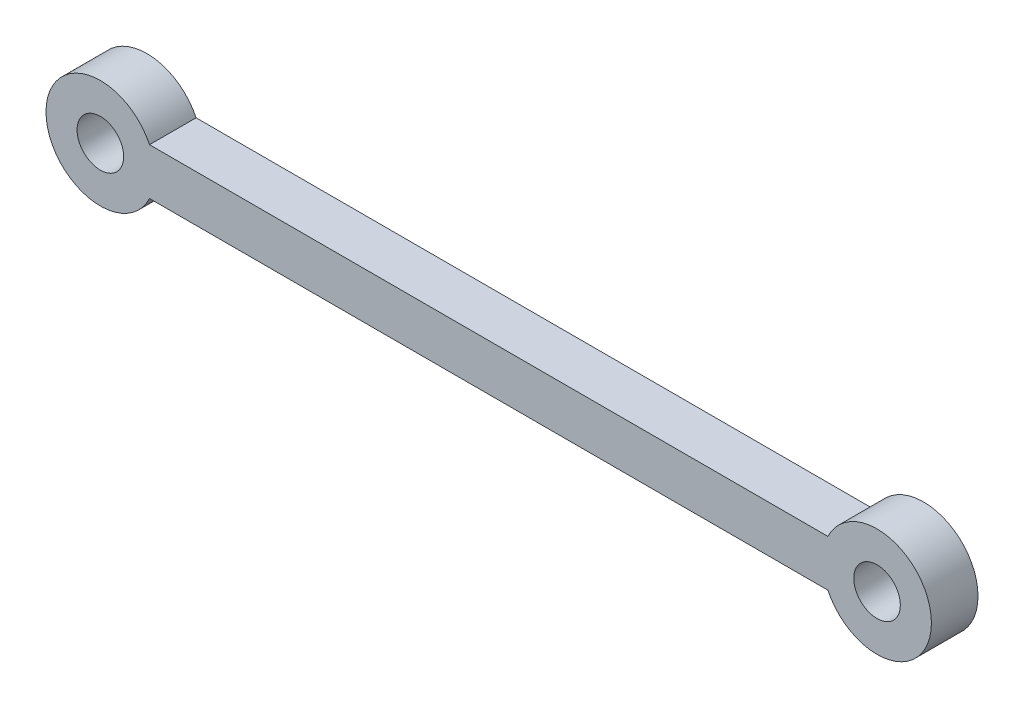
ISO-10303-21;
HEADER;
FILE_DESCRIPTION(('STEP AP214'),'2;1');
FILE_NAME('part.step','',(''),(''),'','','');
FILE_SCHEMA(('AUTOMOTIVE_DESIGN { 1 0 10303 214 1 1 1 1 }'));
ENDSEC;
DATA;
#1=APPLICATION_CONTEXT('core data for automotive mechanical design processes');
#2=APPLICATION_PROTOCOL_DEFINITION('international standard','automotive_design',2000,#1);
#3=PRODUCT_CONTEXT('',#1,'mechanical');
#4=PRODUCT('Part','Part','',(#3));
#5=PRODUCT_RELATED_PRODUCT_CATEGORY('part','',(#4));
#6=PRODUCT_DEFINITION_FORMATION('','',#4);
#7=PRODUCT_DEFINITION_CONTEXT('part definition',#1,'design');
#8=PRODUCT_DEFINITION('design','',#6,#7);
#9=PRODUCT_DEFINITION_SHAPE('','',#8);
#10=(LENGTH_UNIT() NAMED_UNIT(*) SI_UNIT(.MILLI.,.METRE.));
#11=(NAMED_UNIT(*) PLANE_ANGLE_UNIT() SI_UNIT($,.RADIAN.));
#12=(NAMED_UNIT(*) SI_UNIT($,.STERADIAN.) SOLID_ANGLE_UNIT());
#13=UNCERTAINTY_MEASURE_WITH_UNIT(LENGTH_MEASURE(1.E-05),#10,'distance_accuracy_value','');
#14=(GEOMETRIC_REPRESENTATION_CONTEXT(3) GLOBAL_UNCERTAINTY_ASSIGNED_CONTEXT((#13)) GLOBAL_UNIT_ASSIGNED_CONTEXT((#10,
#11,#12)) REPRESENTATION_CONTEXT('',''));
#15=CARTESIAN_POINT('',(0.,0.,0.));
#16=DIRECTION('',(0.,0.,1.));
#17=DIRECTION('',(1.,0.,0.));
#18=AXIS2_PLACEMENT_3D('',#15,#16,#17);
#19=CARTESIAN_POINT('',(0.,0.,3.));
#20=DIRECTION('',(0.,0.,1.));
#21=DIRECTION('',(1.,0.,0.));
#22=AXIS2_PLACEMENT_3D('',#19,#20,#21);
#23=PLANE('',#22);
#24=CARTESIAN_POINT('',(0.,0.,3.));
#25=DIRECTION('',(0.,0.,1.));
#26=DIRECTION('',(1.,0.,0.));
#27=AXIS2_PLACEMENT_3D('',#24,#25,#26);
#28=CIRCLE('',#27,1.5);
#29=CARTESIAN_POINT('',(1.5,0.,3.));
#30=VERTEX_POINT('',#29);
#31=EDGE_CURVE('E102',#30,#30,#28,.T.);
#32=ORIENTED_EDGE('',*,*,#31,.F.);
#33=EDGE_LOOP('',(#32));
#34=FACE_BOUND('',#33,.T.);
#35=CARTESIAN_POINT('',(0.,0.,3.));
#36=DIRECTION('',(0.,0.,1.));
#37=DIRECTION('',(1.,0.,0.));
#38=AXIS2_PLACEMENT_3D('',#35,#36,#37);
#39=CIRCLE('',#38,3.5);
#40=CARTESIAN_POINT('',(3.16227766016838,1.5,3.));
#41=VERTEX_POINT('',#40);
#42=CARTESIAN_POINT('',(3.16227766016838,-1.5,3.));
#43=VERTEX_POINT('',#42);
#44=EDGE_CURVE('E87',#41,#43,#39,.T.);
#45=ORIENTED_EDGE('',*,*,#44,.T.);
#46=DIRECTION('',(1.,0.,0.));
#47=VECTOR('',#46,1.);
#48=CARTESIAN_POINT('',(3.16227766016838,-1.5,3.));
#49=LINE('',#48,#47);
#50=CARTESIAN_POINT('',(46.8377223398316,-1.5,3.));
#51=VERTEX_POINT('',#50);
#52=EDGE_CURVE('E82',#43,#51,#49,.T.);
#53=ORIENTED_EDGE('',*,*,#52,.T.);
#54=CARTESIAN_POINT('',(50.,0.,3.));
#55=DIRECTION('',(0.,0.,1.));
#56=DIRECTION('',(1.,0.,0.));
#57=AXIS2_PLACEMENT_3D('',#54,#55,#56);
#58=CIRCLE('',#57,3.49999999999999);
#59=CARTESIAN_POINT('',(46.8377223398316,1.5,3.));
#60=VERTEX_POINT('',#59);
#61=EDGE_CURVE('E85',#51,#60,#58,.T.);
#62=ORIENTED_EDGE('',*,*,#61,.T.);
#63=DIRECTION('',(-1.,0.,0.));
#64=VECTOR('',#63,1.);
#65=CARTESIAN_POINT('',(3.16227766016838,1.5,3.));
#66=LINE('',#65,#64);
#67=EDGE_CURVE('E52',#60,#41,#66,.T.);
#68=ORIENTED_EDGE('',*,*,#67,.T.);
#69=EDGE_LOOP('',(#45,#53,#62,#68));
#70=FACE_BOUND('',#69,.T.);
#71=CARTESIAN_POINT('',(50.,0.,3.));
#72=DIRECTION('',(0.,0.,1.));
#73=DIRECTION('',(1.,0.,0.));
#74=AXIS2_PLACEMENT_3D('',#71,#72,#73);
#75=CIRCLE('',#74,1.5);
#76=CARTESIAN_POINT('',(51.5,0.,3.));
#77=VERTEX_POINT('',#76);
#78=EDGE_CURVE('E117',#77,#77,#75,.T.);
#79=ORIENTED_EDGE('',*,*,#78,.F.);
#80=EDGE_LOOP('',(#79));
#81=FACE_BOUND('',#80,.T.);
#82=ADVANCED_FACE('F35',(#34,#70,#81),#23,.T.);
#83=CARTESIAN_POINT('',(0.,0.,0.));
#84=DIRECTION('',(0.,0.,1.));
#85=DIRECTION('',(1.,0.,0.));
#86=AXIS2_PLACEMENT_3D('',#83,#84,#85);
#87=PLANE('',#86);
#88=CARTESIAN_POINT('',(0.,0.,0.));
#89=DIRECTION('',(0.,0.,1.));
#90=DIRECTION('',(1.,0.,0.));
#91=AXIS2_PLACEMENT_3D('',#88,#89,#90);
#92=CIRCLE('',#91,3.5);
#93=CARTESIAN_POINT('',(3.16227766016838,1.5,0.));
#94=VERTEX_POINT('',#93);
#95=CARTESIAN_POINT('',(3.16227766016838,-1.5,0.));
#96=VERTEX_POINT('',#95);
#97=EDGE_CURVE('E99',#94,#96,#92,.T.);
#98=ORIENTED_EDGE('',*,*,#97,.F.);
#99=DIRECTION('',(-1.,0.,0.));
#100=VECTOR('',#99,1.);
#101=CARTESIAN_POINT('',(3.16227766016838,1.5,0.));
#102=LINE('',#101,#100);
#103=CARTESIAN_POINT('',(46.8377223398316,1.5,0.));
#104=VERTEX_POINT('',#103);
#105=EDGE_CURVE('E75',#104,#94,#102,.T.);
#106=ORIENTED_EDGE('',*,*,#105,.F.);
#107=CARTESIAN_POINT('',(50.,0.,0.));
#108=DIRECTION('',(0.,0.,1.));
#109=DIRECTION('',(1.,0.,0.));
#110=AXIS2_PLACEMENT_3D('',#107,#108,#109);
#111=CIRCLE('',#110,3.49999999999999);
#112=CARTESIAN_POINT('',(46.8377223398316,-1.5,0.));
#113=VERTEX_POINT('',#112);
#114=EDGE_CURVE('E69',#113,#104,#111,.T.);
#115=ORIENTED_EDGE('',*,*,#114,.F.);
#116=DIRECTION('',(1.,0.,0.));
#117=VECTOR('',#116,1.);
#118=CARTESIAN_POINT('',(3.16227766016838,-1.5,0.));
#119=LINE('',#118,#117);
#120=EDGE_CURVE('E91',#96,#113,#119,.T.);
#121=ORIENTED_EDGE('',*,*,#120,.F.);
#122=EDGE_LOOP('',(#98,#106,#115,#121));
#123=FACE_BOUND('',#122,.T.);
#124=CARTESIAN_POINT('',(0.,0.,0.));
#125=DIRECTION('',(0.,0.,1.));
#126=DIRECTION('',(1.,0.,0.));
#127=AXIS2_PLACEMENT_3D('',#124,#125,#126);
#128=CIRCLE('',#127,1.5);
#129=CARTESIAN_POINT('',(1.5,0.,0.));
#130=VERTEX_POINT('',#129);
#131=EDGE_CURVE('E114',#130,#130,#128,.T.);
#132=ORIENTED_EDGE('',*,*,#131,.T.);
#133=EDGE_LOOP('',(#132));
#134=FACE_BOUND('',#133,.T.);
#135=CARTESIAN_POINT('',(50.,0.,0.));
#136=DIRECTION('',(0.,0.,1.));
#137=DIRECTION('',(1.,0.,0.));
#138=AXIS2_PLACEMENT_3D('',#135,#136,#137);
#139=CIRCLE('',#138,1.5);
#140=CARTESIAN_POINT('',(51.5,0.,0.));
#141=VERTEX_POINT('',#140);
#142=EDGE_CURVE('E120',#141,#141,#139,.T.);
#143=ORIENTED_EDGE('',*,*,#142,.T.);
#144=EDGE_LOOP('',(#143));
#145=FACE_BOUND('',#144,.T.);
#146=ADVANCED_FACE('F110',(#123,#134,#145),#87,.F.);
#147=CARTESIAN_POINT('',(0.,0.,3.));
#148=DIRECTION('',(0.,0.,-1.));
#149=DIRECTION('',(-1.,0.,0.));
#150=AXIS2_PLACEMENT_3D('',#147,#148,#149);
#151=CYLINDRICAL_SURFACE('',#150,3.5);
#152=ORIENTED_EDGE('',*,*,#97,.T.);
#153=DIRECTION('',(0.,0.,-1.));
#154=VECTOR('',#153,1.);
#155=CARTESIAN_POINT('',(3.16227766016838,-1.5,3.));
#156=LINE('',#155,#154);
#157=EDGE_CURVE('E11',#43,#96,#156,.T.);
#158=ORIENTED_EDGE('',*,*,#157,.F.);
#159=ORIENTED_EDGE('',*,*,#44,.F.);
#160=DIRECTION('',(0.,0.,-1.));
#161=VECTOR('',#160,1.);
#162=CARTESIAN_POINT('',(3.16227766016838,1.5,3.));
#163=LINE('',#162,#161);
#164=EDGE_CURVE('E95',#41,#94,#163,.T.);
#165=ORIENTED_EDGE('',*,*,#164,.T.);
#166=EDGE_LOOP('',(#152,#158,#159,#165));
#167=FACE_BOUND('',#166,.T.);
#168=ADVANCED_FACE('F37',(#167),#151,.T.);
#169=CARTESIAN_POINT('',(3.16227766016838,-1.5,3.));
#170=DIRECTION('',(0.,1.,0.));
#171=DIRECTION('',(0.,0.,1.));
#172=AXIS2_PLACEMENT_3D('',#169,#170,#171);
#173=PLANE('',#172);
#174=ORIENTED_EDGE('',*,*,#120,.T.);
#175=DIRECTION('',(0.,0.,-1.));
#176=VECTOR('',#175,1.);
#177=CARTESIAN_POINT('',(46.8377223398316,-1.5,3.));
#178=LINE('',#177,#176);
#179=EDGE_CURVE('E44',#51,#113,#178,.T.);
#180=ORIENTED_EDGE('',*,*,#179,.F.);
#181=ORIENTED_EDGE('',*,*,#52,.F.);
#182=ORIENTED_EDGE('',*,*,#157,.T.);
#183=EDGE_LOOP('',(#174,#180,#181,#182));
#184=FACE_BOUND('',#183,.T.);
#185=ADVANCED_FACE('F90',(#184),#173,.F.);
#186=CARTESIAN_POINT('',(50.,0.,3.));
#187=DIRECTION('',(0.,0.,-1.));
#188=DIRECTION('',(-1.,0.,0.));
#189=AXIS2_PLACEMENT_3D('',#186,#187,#188);
#190=CYLINDRICAL_SURFACE('',#189,3.49999999999999);
#191=ORIENTED_EDGE('',*,*,#114,.T.);
#192=DIRECTION('',(0.,0.,-1.));
#193=VECTOR('',#192,1.);
#194=CARTESIAN_POINT('',(46.8377223398316,1.5,3.));
#195=LINE('',#194,#193);
#196=EDGE_CURVE('E92',#60,#104,#195,.T.);
#197=ORIENTED_EDGE('',*,*,#196,.F.);
#198=ORIENTED_EDGE('',*,*,#61,.F.);
#199=ORIENTED_EDGE('',*,*,#179,.T.);
#200=EDGE_LOOP('',(#191,#197,#198,#199));
#201=FACE_BOUND('',#200,.T.);
#202=ADVANCED_FACE('F93',(#201),#190,.T.);
#203=CARTESIAN_POINT('',(3.16227766016838,1.5,3.));
#204=DIRECTION('',(0.,-1.,0.));
#205=DIRECTION('',(0.,0.,-1.));
#206=AXIS2_PLACEMENT_3D('',#203,#204,#205);
#207=PLANE('',#206);
#208=ORIENTED_EDGE('',*,*,#105,.T.);
#209=ORIENTED_EDGE('',*,*,#164,.F.);
#210=ORIENTED_EDGE('',*,*,#67,.F.);
#211=ORIENTED_EDGE('',*,*,#196,.T.);
#212=EDGE_LOOP('',(#208,#209,#210,#211));
#213=FACE_BOUND('',#212,.T.);
#214=ADVANCED_FACE('F107',(#213),#207,.F.);
#215=CARTESIAN_POINT('',(0.,0.,3.));
#216=DIRECTION('',(0.,0.,-1.));
#217=DIRECTION('',(-1.,0.,0.));
#218=AXIS2_PLACEMENT_3D('',#215,#216,#217);
#219=CYLINDRICAL_SURFACE('',#218,1.5);
#220=ORIENTED_EDGE('',*,*,#31,.T.);
#221=EDGE_LOOP('',(#220));
#222=FACE_BOUND('',#221,.T.);
#223=ORIENTED_EDGE('',*,*,#131,.F.);
#224=EDGE_LOOP('',(#223));
#225=FACE_BOUND('',#224,.T.);
#226=ADVANCED_FACE('F137',(#222,#225),#219,.F.);
#227=CARTESIAN_POINT('',(50.,0.,3.));
#228=DIRECTION('',(0.,0.,-1.));
#229=DIRECTION('',(-1.,0.,0.));
#230=AXIS2_PLACEMENT_3D('',#227,#228,#229);
#231=CYLINDRICAL_SURFACE('',#230,1.5);
#232=ORIENTED_EDGE('',*,*,#78,.T.);
#233=EDGE_LOOP('',(#232));
#234=FACE_BOUND('',#233,.T.);
#235=ORIENTED_EDGE('',*,*,#142,.F.);
#236=EDGE_LOOP('',(#235));
#237=FACE_BOUND('',#236,.T.);
#238=ADVANCED_FACE('F126',(#234,#237),#231,.F.);
#239=CLOSED_SHELL('',(#82,#146,#168,#185,#202,#214,#226,#238));
#240=MANIFOLD_SOLID_BREP('B2',#239);
#241=ADVANCED_BREP_SHAPE_REPRESENTATION('',(#18,#240),#14);
#242=SHAPE_DEFINITION_REPRESENTATION(#9,#241);
ENDSEC;
END-ISO-10303-21;
